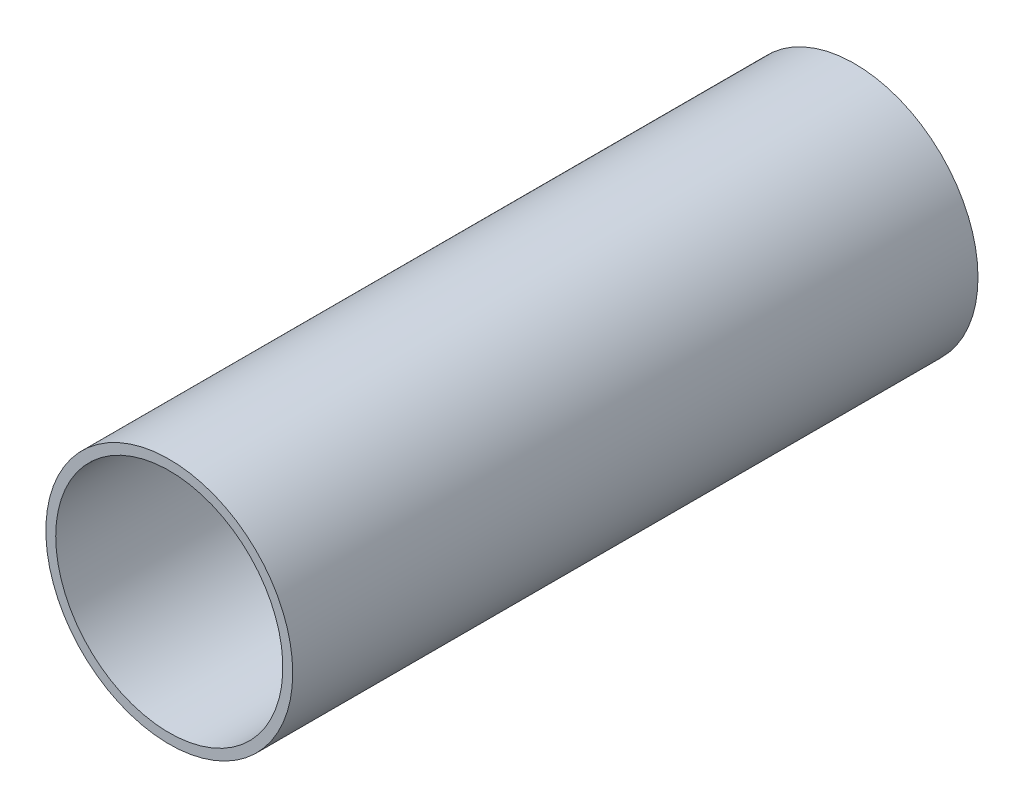
ISO-10303-21;
HEADER;
FILE_DESCRIPTION(('STEP AP214'),'2;1');
FILE_NAME('part.step','',(''),(''),'','','');
FILE_SCHEMA(('AUTOMOTIVE_DESIGN { 1 0 10303 214 1 1 1 1 }'));
ENDSEC;
DATA;
#1=APPLICATION_CONTEXT('core data for automotive mechanical design processes');
#2=APPLICATION_PROTOCOL_DEFINITION('international standard','automotive_design',2000,#1);
#3=PRODUCT_CONTEXT('',#1,'mechanical');
#4=PRODUCT('Part','Part','',(#3));
#5=PRODUCT_RELATED_PRODUCT_CATEGORY('part','',(#4));
#6=PRODUCT_DEFINITION_FORMATION('','',#4);
#7=PRODUCT_DEFINITION_CONTEXT('part definition',#1,'design');
#8=PRODUCT_DEFINITION('design','',#6,#7);
#9=PRODUCT_DEFINITION_SHAPE('','',#8);
#10=(LENGTH_UNIT() NAMED_UNIT(*) SI_UNIT(.MILLI.,.METRE.));
#11=(NAMED_UNIT(*) PLANE_ANGLE_UNIT() SI_UNIT($,.RADIAN.));
#12=(NAMED_UNIT(*) SI_UNIT($,.STERADIAN.) SOLID_ANGLE_UNIT());
#13=UNCERTAINTY_MEASURE_WITH_UNIT(LENGTH_MEASURE(1.E-05),#10,'distance_accuracy_value','');
#14=(GEOMETRIC_REPRESENTATION_CONTEXT(3) GLOBAL_UNCERTAINTY_ASSIGNED_CONTEXT((#13)) GLOBAL_UNIT_ASSIGNED_CONTEXT((#10,
#11,#12)) REPRESENTATION_CONTEXT('',''));
#15=CARTESIAN_POINT('',(0.,0.,0.));
#16=DIRECTION('',(0.,0.,1.));
#17=DIRECTION('',(1.,0.,0.));
#18=AXIS2_PLACEMENT_3D('',#15,#16,#17);
#19=CARTESIAN_POINT('',(0.,0.,57.2897));
#20=DIRECTION('',(0.,0.,-1.));
#21=DIRECTION('',(0.,-1.,0.));
#22=AXIS2_PLACEMENT_3D('',#19,#20,#21);
#23=PLANE('',#22);
#24=CARTESIAN_POINT('',(0.,0.,57.2897));
#25=DIRECTION('',(0.,0.,-1.));
#26=DIRECTION('',(-1.,0.,0.));
#27=AXIS2_PLACEMENT_3D('',#24,#25,#26);
#28=CIRCLE('',#27,18.9865);
#29=CARTESIAN_POINT('',(-18.9865,0.,57.2897));
#30=VERTEX_POINT('',#29);
#31=EDGE_CURVE('E11',#30,#30,#28,.T.);
#32=ORIENTED_EDGE('',*,*,#31,.T.);
#33=EDGE_LOOP('',(#32));
#34=FACE_BOUND('',#33,.T.);
#35=CARTESIAN_POINT('',(0.,0.,57.2897));
#36=DIRECTION('',(0.,0.,-1.));
#37=DIRECTION('',(1.,0.,0.));
#38=AXIS2_PLACEMENT_3D('',#35,#36,#37);
#39=CIRCLE('',#38,20.6375);
#40=CARTESIAN_POINT('',(20.6375,0.,57.2897));
#41=VERTEX_POINT('',#40);
#42=EDGE_CURVE('E54',#41,#41,#39,.T.);
#43=ORIENTED_EDGE('',*,*,#42,.F.);
#44=EDGE_LOOP('',(#43));
#45=FACE_BOUND('',#44,.T.);
#46=ADVANCED_FACE('F16',(#34,#45),#23,.F.);
#47=CARTESIAN_POINT('',(0.,0.,-57.2897));
#48=DIRECTION('',(0.,0.,-1.));
#49=DIRECTION('',(0.,-1.,0.));
#50=AXIS2_PLACEMENT_3D('',#47,#48,#49);
#51=PLANE('',#50);
#52=CARTESIAN_POINT('',(0.,0.,-57.2897));
#53=DIRECTION('',(0.,0.,-1.));
#54=DIRECTION('',(-1.,0.,0.));
#55=AXIS2_PLACEMENT_3D('',#52,#53,#54);
#56=CIRCLE('',#55,18.9865);
#57=CARTESIAN_POINT('',(-18.9865,0.,-57.2897));
#58=VERTEX_POINT('',#57);
#59=EDGE_CURVE('E19',#58,#58,#56,.T.);
#60=ORIENTED_EDGE('',*,*,#59,.F.);
#61=EDGE_LOOP('',(#60));
#62=FACE_BOUND('',#61,.T.);
#63=CARTESIAN_POINT('',(0.,0.,-57.2897));
#64=DIRECTION('',(0.,0.,-1.));
#65=DIRECTION('',(1.,0.,0.));
#66=AXIS2_PLACEMENT_3D('',#63,#64,#65);
#67=CIRCLE('',#66,20.6375);
#68=CARTESIAN_POINT('',(20.6375,0.,-57.2897));
#69=VERTEX_POINT('',#68);
#70=EDGE_CURVE('E50',#69,#69,#67,.T.);
#71=ORIENTED_EDGE('',*,*,#70,.T.);
#72=EDGE_LOOP('',(#71));
#73=FACE_BOUND('',#72,.T.);
#74=ADVANCED_FACE('F51',(#62,#73),#51,.T.);
#75=CARTESIAN_POINT('',(0.,0.,57.2897));
#76=DIRECTION('',(0.,0.,1.));
#77=DIRECTION('',(-1.,0.,0.));
#78=AXIS2_PLACEMENT_3D('',#75,#76,#77);
#79=CYLINDRICAL_SURFACE('',#78,18.9865);
#80=ORIENTED_EDGE('',*,*,#31,.F.);
#81=EDGE_LOOP('',(#80));
#82=FACE_BOUND('',#81,.T.);
#83=ORIENTED_EDGE('',*,*,#59,.T.);
#84=EDGE_LOOP('',(#83));
#85=FACE_BOUND('',#84,.T.);
#86=ADVANCED_FACE('F71',(#82,#85),#79,.F.);
#87=CARTESIAN_POINT('',(0.,0.,57.2897));
#88=DIRECTION('',(0.,0.,1.));
#89=DIRECTION('',(-1.,0.,0.));
#90=AXIS2_PLACEMENT_3D('',#87,#88,#89);
#91=CYLINDRICAL_SURFACE('',#90,20.6375);
#92=ORIENTED_EDGE('',*,*,#42,.T.);
#93=EDGE_LOOP('',(#92));
#94=FACE_BOUND('',#93,.T.);
#95=ORIENTED_EDGE('',*,*,#70,.F.);
#96=EDGE_LOOP('',(#95));
#97=FACE_BOUND('',#96,.T.);
#98=ADVANCED_FACE('F66',(#94,#97),#91,.T.);
#99=CLOSED_SHELL('',(#46,#74,#86,#98));
#100=MANIFOLD_SOLID_BREP('B1',#99);
#101=ADVANCED_BREP_SHAPE_REPRESENTATION('',(#18,#100),#14);
#102=SHAPE_DEFINITION_REPRESENTATION(#9,#101);
ENDSEC;
END-ISO-10303-21;
